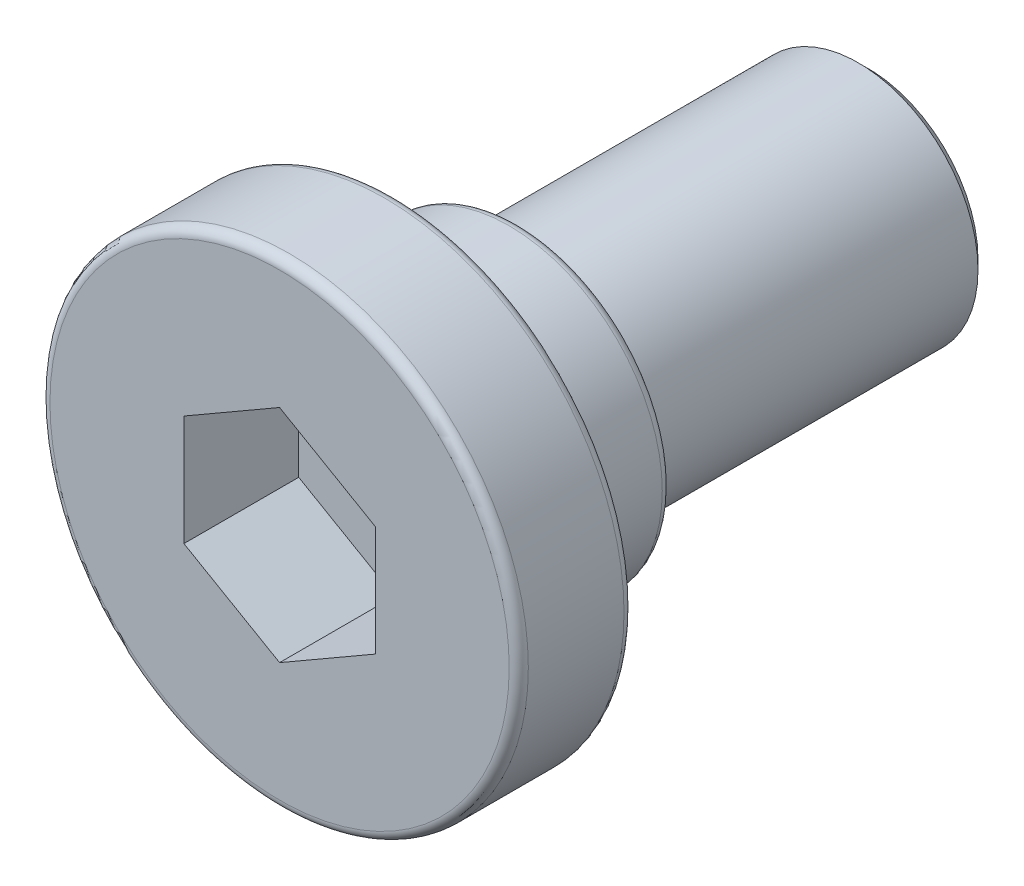
ISO-10303-21;
HEADER;
FILE_DESCRIPTION(('STEP AP214'),'2;1');
FILE_NAME('part.step','',(''),(''),'','','');
FILE_SCHEMA(('AUTOMOTIVE_DESIGN { 1 0 10303 214 1 1 1 1 }'));
ENDSEC;
DATA;
#1=APPLICATION_CONTEXT('core data for automotive mechanical design processes');
#2=APPLICATION_PROTOCOL_DEFINITION('international standard','automotive_design',2000,#1);
#3=PRODUCT_CONTEXT('',#1,'mechanical');
#4=PRODUCT('Part','Part','',(#3));
#5=PRODUCT_RELATED_PRODUCT_CATEGORY('part','',(#4));
#6=PRODUCT_DEFINITION_FORMATION('','',#4);
#7=PRODUCT_DEFINITION_CONTEXT('part definition',#1,'design');
#8=PRODUCT_DEFINITION('design','',#6,#7);
#9=PRODUCT_DEFINITION_SHAPE('','',#8);
#10=(LENGTH_UNIT() NAMED_UNIT(*) SI_UNIT(.MILLI.,.METRE.));
#11=(NAMED_UNIT(*) PLANE_ANGLE_UNIT() SI_UNIT($,.RADIAN.));
#12=(NAMED_UNIT(*) SI_UNIT($,.STERADIAN.) SOLID_ANGLE_UNIT());
#13=UNCERTAINTY_MEASURE_WITH_UNIT(LENGTH_MEASURE(1.E-05),#10,'distance_accuracy_value','');
#14=(GEOMETRIC_REPRESENTATION_CONTEXT(3) GLOBAL_UNCERTAINTY_ASSIGNED_CONTEXT((#13)) GLOBAL_UNIT_ASSIGNED_CONTEXT((#10,
#11,#12)) REPRESENTATION_CONTEXT('',''));
#15=CARTESIAN_POINT('',(0.,0.,0.));
#16=DIRECTION('',(0.,0.,1.));
#17=DIRECTION('',(1.,0.,0.));
#18=AXIS2_PLACEMENT_3D('',#15,#16,#17);
#19=CARTESIAN_POINT('',(0.,0.,0.));
#20=DIRECTION('',(0.,0.,1.));
#21=DIRECTION('',(1.,0.,0.));
#22=AXIS2_PLACEMENT_3D('',#19,#20,#21);
#23=PLANE('',#22);
#24=CARTESIAN_POINT('',(0.,0.,5.68434324133352E-11));
#25=DIRECTION('',(0.,0.,1.));
#26=DIRECTION('',(1.,0.,0.));
#27=AXIS2_PLACEMENT_3D('',#24,#25,#26);
#28=CIRCLE('',#27,1.15000000005239);
#29=CARTESIAN_POINT('',(1.15000000005239,0.,5.68434324133352E-11));
#30=VERTEX_POINT('',#29);
#31=EDGE_CURVE('E172',#30,#30,#28,.T.);
#32=ORIENTED_EDGE('',*,*,#31,.F.);
#33=EDGE_LOOP('',(#32));
#34=FACE_BOUND('',#33,.T.);
#35=ADVANCED_FACE('F16',(#34),#23,.F.);
#36=CARTESIAN_POINT('',(0.,0.,0.0999999998612111));
#37=DIRECTION('',(0.,0.,1.));
#38=DIRECTION('',(1.,0.,0.));
#39=AXIS2_PLACEMENT_3D('',#36,#37,#38);
#40=CONICAL_SURFACE('',#39,1.2499999999136,0.785398163681665);
#41=ORIENTED_EDGE('',*,*,#31,.T.);
#42=EDGE_LOOP('',(#41));
#43=FACE_BOUND('',#42,.T.);
#44=CARTESIAN_POINT('',(0.,0.,0.099999999999999));
#45=DIRECTION('',(0.,0.,-1.));
#46=DIRECTION('',(-1.,0.,0.));
#47=AXIS2_PLACEMENT_3D('',#44,#45,#46);
#48=CIRCLE('',#47,1.25);
#49=CARTESIAN_POINT('',(-1.25,0.,0.099999999999999));
#50=VERTEX_POINT('',#49);
#51=EDGE_CURVE('E131',#50,#50,#48,.F.);
#52=ORIENTED_EDGE('',*,*,#51,.F.);
#53=EDGE_LOOP('',(#52));
#54=FACE_BOUND('',#53,.T.);
#55=ADVANCED_FACE('F478',(#43,#54),#40,.T.);
#56=CARTESIAN_POINT('',(0.,0.,3.65));
#57=DIRECTION('',(0.,0.,-1.));
#58=DIRECTION('',(-1.,0.,0.));
#59=AXIS2_PLACEMENT_3D('',#56,#57,#58);
#60=CYLINDRICAL_SURFACE('',#59,1.25);
#61=CARTESIAN_POINT('',(0.,0.,3.65));
#62=DIRECTION('',(0.,0.,-1.));
#63=DIRECTION('',(-1.,0.,0.));
#64=AXIS2_PLACEMENT_3D('',#61,#62,#63);
#65=CIRCLE('',#64,1.25);
#66=CARTESIAN_POINT('',(-1.25,0.,3.65));
#67=VERTEX_POINT('',#66);
#68=EDGE_CURVE('E115',#67,#67,#65,.T.);
#69=ORIENTED_EDGE('',*,*,#68,.T.);
#70=EDGE_LOOP('',(#69));
#71=FACE_BOUND('',#70,.T.);
#72=ORIENTED_EDGE('',*,*,#51,.T.);
#73=EDGE_LOOP('',(#72));
#74=FACE_BOUND('',#73,.T.);
#75=ADVANCED_FACE('F470',(#71,#74),#60,.T.);
#76=CARTESIAN_POINT('',(0.,0.,3.65));
#77=DIRECTION('',(0.,0.,1.));
#78=DIRECTION('',(1.,0.,0.));
#79=AXIS2_PLACEMENT_3D('',#76,#77,#78);
#80=PLANE('',#79);
#81=ORIENTED_EDGE('',*,*,#68,.F.);
#82=EDGE_LOOP('',(#81));
#83=FACE_BOUND('',#82,.T.);
#84=CARTESIAN_POINT('',(0.,0.,3.65));
#85=DIRECTION('',(0.,0.,1.));
#86=DIRECTION('',(1.,0.,0.));
#87=AXIS2_PLACEMENT_3D('',#84,#85,#86);
#88=CIRCLE('',#87,1.5);
#89=CARTESIAN_POINT('',(1.5,0.,3.65));
#90=VERTEX_POINT('',#89);
#91=CARTESIAN_POINT('',(-1.5,0.,3.65));
#92=VERTEX_POINT('',#91);
#93=EDGE_CURVE('E106',#90,#92,#88,.T.);
#94=ORIENTED_EDGE('',*,*,#93,.F.);
#95=CARTESIAN_POINT('',(0.,0.,3.65));
#96=DIRECTION('',(0.,0.,1.));
#97=DIRECTION('',(-1.,0.,0.));
#98=AXIS2_PLACEMENT_3D('',#95,#96,#97);
#99=CIRCLE('',#98,1.5);
#100=EDGE_CURVE('E112',#92,#90,#99,.T.);
#101=ORIENTED_EDGE('',*,*,#100,.F.);
#102=EDGE_LOOP('',(#94,#101));
#103=FACE_BOUND('',#102,.T.);
#104=ADVANCED_FACE('F111',(#83,#103),#80,.F.);
#105=CARTESIAN_POINT('',(0.,0.,3.75));
#106=DIRECTION('',(0.,0.,1.));
#107=DIRECTION('',(1.,0.,0.));
#108=AXIS2_PLACEMENT_3D('',#105,#106,#107);
#109=TOROIDAL_SURFACE('',#108,1.5,0.1);
#110=ORIENTED_EDGE('',*,*,#93,.T.);
#111=ORIENTED_EDGE('',*,*,#100,.T.);
#112=EDGE_LOOP('',(#110,#111));
#113=FACE_BOUND('',#112,.T.);
#114=CARTESIAN_POINT('',(0.,0.,3.75));
#115=DIRECTION('',(0.,0.,-1.));
#116=DIRECTION('',(-1.,0.,0.));
#117=AXIS2_PLACEMENT_3D('',#114,#115,#116);
#118=CIRCLE('',#117,1.6);
#119=CARTESIAN_POINT('',(-1.6,0.,3.75));
#120=VERTEX_POINT('',#119);
#121=EDGE_CURVE('E122',#120,#120,#118,.F.);
#122=ORIENTED_EDGE('',*,*,#121,.F.);
#123=EDGE_LOOP('',(#122));
#124=FACE_BOUND('',#123,.T.);
#125=ADVANCED_FACE('F119',(#113,#124),#109,.T.);
#126=CARTESIAN_POINT('',(0.,0.,4.95));
#127=DIRECTION('',(0.,0.,-1.));
#128=DIRECTION('',(-1.,0.,0.));
#129=AXIS2_PLACEMENT_3D('',#126,#127,#128);
#130=CYLINDRICAL_SURFACE('',#129,1.6);
#131=CARTESIAN_POINT('',(0.,0.,4.95));
#132=DIRECTION('',(0.,0.,-1.));
#133=DIRECTION('',(-1.,0.,0.));
#134=AXIS2_PLACEMENT_3D('',#131,#132,#133);
#135=CIRCLE('',#134,1.6);
#136=CARTESIAN_POINT('',(-1.6,0.,4.95));
#137=VERTEX_POINT('',#136);
#138=EDGE_CURVE('E155',#137,#137,#135,.T.);
#139=ORIENTED_EDGE('',*,*,#138,.T.);
#140=EDGE_LOOP('',(#139));
#141=FACE_BOUND('',#140,.T.);
#142=ORIENTED_EDGE('',*,*,#121,.T.);
#143=EDGE_LOOP('',(#142));
#144=FACE_BOUND('',#143,.T.);
#145=ADVANCED_FACE('F142',(#141,#144),#130,.T.);
#146=CARTESIAN_POINT('',(0.,0.,4.95));
#147=DIRECTION('',(0.,0.,1.));
#148=DIRECTION('',(1.,0.,0.));
#149=AXIS2_PLACEMENT_3D('',#146,#147,#148);
#150=PLANE('',#149);
#151=ORIENTED_EDGE('',*,*,#138,.F.);
#152=EDGE_LOOP('',(#151));
#153=FACE_BOUND('',#152,.T.);
#154=CARTESIAN_POINT('',(0.,0.,4.95));
#155=DIRECTION('',(0.,0.,1.));
#156=DIRECTION('',(1.,0.,0.));
#157=AXIS2_PLACEMENT_3D('',#154,#155,#156);
#158=CIRCLE('',#157,2.4);
#159=CARTESIAN_POINT('',(2.4,0.,4.95));
#160=VERTEX_POINT('',#159);
#161=CARTESIAN_POINT('',(-2.4,0.,4.95));
#162=VERTEX_POINT('',#161);
#163=EDGE_CURVE('E162',#160,#162,#158,.T.);
#164=ORIENTED_EDGE('',*,*,#163,.F.);
#165=CARTESIAN_POINT('',(0.,0.,4.95));
#166=DIRECTION('',(0.,0.,1.));
#167=DIRECTION('',(-1.,0.,0.));
#168=AXIS2_PLACEMENT_3D('',#165,#166,#167);
#169=CIRCLE('',#168,2.4);
#170=EDGE_CURVE('E168',#162,#160,#169,.T.);
#171=ORIENTED_EDGE('',*,*,#170,.F.);
#172=EDGE_LOOP('',(#164,#171));
#173=FACE_BOUND('',#172,.T.);
#174=ADVANCED_FACE('F230',(#153,#173),#150,.F.);
#175=CARTESIAN_POINT('',(0.,0.,5.05));
#176=DIRECTION('',(0.,0.,1.));
#177=DIRECTION('',(1.,0.,0.));
#178=AXIS2_PLACEMENT_3D('',#175,#176,#177);
#179=TOROIDAL_SURFACE('',#178,2.4,0.1);
#180=ORIENTED_EDGE('',*,*,#163,.T.);
#181=ORIENTED_EDGE('',*,*,#170,.T.);
#182=EDGE_LOOP('',(#180,#181));
#183=FACE_BOUND('',#182,.T.);
#184=CARTESIAN_POINT('',(0.,0.,5.05));
#185=DIRECTION('',(0.,0.,-1.));
#186=DIRECTION('',(-1.,0.,0.));
#187=AXIS2_PLACEMENT_3D('',#184,#185,#186);
#188=CIRCLE('',#187,2.5);
#189=CARTESIAN_POINT('',(-2.5,0.,5.05));
#190=VERTEX_POINT('',#189);
#191=EDGE_CURVE('E222',#190,#190,#188,.F.);
#192=ORIENTED_EDGE('',*,*,#191,.F.);
#193=EDGE_LOOP('',(#192));
#194=FACE_BOUND('',#193,.T.);
#195=ADVANCED_FACE('F226',(#183,#194),#179,.T.);
#196=CARTESIAN_POINT('',(0.,0.,6.15));
#197=DIRECTION('',(0.,0.,-1.));
#198=DIRECTION('',(-1.,0.,0.));
#199=AXIS2_PLACEMENT_3D('',#196,#197,#198);
#200=CYLINDRICAL_SURFACE('',#199,2.5);
#201=CARTESIAN_POINT('',(0.,0.,6.05));
#202=DIRECTION('',(0.,0.,1.));
#203=DIRECTION('',(1.,0.,0.));
#204=AXIS2_PLACEMENT_3D('',#201,#202,#203);
#205=CIRCLE('',#204,2.5);
#206=CARTESIAN_POINT('',(2.5,0.,6.05));
#207=VERTEX_POINT('',#206);
#208=EDGE_CURVE('E213',#207,#207,#205,.T.);
#209=ORIENTED_EDGE('',*,*,#208,.F.);
#210=EDGE_LOOP('',(#209));
#211=FACE_BOUND('',#210,.T.);
#212=ORIENTED_EDGE('',*,*,#191,.T.);
#213=EDGE_LOOP('',(#212));
#214=FACE_BOUND('',#213,.T.);
#215=ADVANCED_FACE('F229',(#211,#214),#200,.T.);
#216=CARTESIAN_POINT('',(0.,0.,4.95));
#217=DIRECTION('',(0.,0.,1.));
#218=DIRECTION('',(1.,0.,0.));
#219=AXIS2_PLACEMENT_3D('',#216,#217,#218);
#220=PLANE('',#219);
#221=DIRECTION('',(0.866025403784439,0.5,0.));
#222=VECTOR('',#221,1.);
#223=CARTESIAN_POINT('',(0.,-1.15470053837925,4.95));
#224=LINE('',#223,#222);
#225=CARTESIAN_POINT('',(0.,-1.15470053837925,4.95));
#226=VERTEX_POINT('',#225);
#227=CARTESIAN_POINT('',(1.,-0.577350269189626,4.95));
#228=VERTEX_POINT('',#227);
#229=EDGE_CURVE('E345',#226,#228,#224,.T.);
#230=ORIENTED_EDGE('',*,*,#229,.T.);
#231=DIRECTION('',(0.,1.,0.));
#232=VECTOR('',#231,1.);
#233=CARTESIAN_POINT('',(1.,-0.577350269189626,4.95));
#234=LINE('',#233,#232);
#235=CARTESIAN_POINT('',(1.,0.577350269189626,4.95));
#236=VERTEX_POINT('',#235);
#237=EDGE_CURVE('E350',#228,#236,#234,.T.);
#238=ORIENTED_EDGE('',*,*,#237,.T.);
#239=DIRECTION('',(-0.866025403784439,0.5,0.));
#240=VECTOR('',#239,1.);
#241=CARTESIAN_POINT('',(1.,0.577350269189626,4.95));
#242=LINE('',#241,#240);
#243=CARTESIAN_POINT('',(0.,1.15470053837925,4.95));
#244=VERTEX_POINT('',#243);
#245=EDGE_CURVE('E207',#236,#244,#242,.T.);
#246=ORIENTED_EDGE('',*,*,#245,.T.);
#247=DIRECTION('',(-0.866025403784439,-0.5,0.));
#248=VECTOR('',#247,1.);
#249=CARTESIAN_POINT('',(0.,1.15470053837925,4.95));
#250=LINE('',#249,#248);
#251=CARTESIAN_POINT('',(-1.,0.577350269189626,4.95));
#252=VERTEX_POINT('',#251);
#253=EDGE_CURVE('E323',#244,#252,#250,.T.);
#254=ORIENTED_EDGE('',*,*,#253,.T.);
#255=DIRECTION('',(0.,-1.,0.));
#256=VECTOR('',#255,1.);
#257=CARTESIAN_POINT('',(-1.,0.577350269189626,4.95));
#258=LINE('',#257,#256);
#259=CARTESIAN_POINT('',(-1.,-0.577350269189626,4.95));
#260=VERTEX_POINT('',#259);
#261=EDGE_CURVE('E333',#252,#260,#258,.T.);
#262=ORIENTED_EDGE('',*,*,#261,.T.);
#263=DIRECTION('',(0.866025403784439,-0.5,0.));
#264=VECTOR('',#263,1.);
#265=CARTESIAN_POINT('',(-1.,-0.577350269189626,4.95));
#266=LINE('',#265,#264);
#267=EDGE_CURVE('E339',#260,#226,#266,.T.);
#268=ORIENTED_EDGE('',*,*,#267,.T.);
#269=EDGE_LOOP('',(#230,#238,#246,#254,#262,#268));
#270=FACE_BOUND('',#269,.T.);
#271=ADVANCED_FACE('F198',(#270),#220,.T.);
#272=CARTESIAN_POINT('',(0.,0.,6.05));
#273=DIRECTION('',(0.,0.,1.));
#274=DIRECTION('',(1.,0.,0.));
#275=AXIS2_PLACEMENT_3D('',#272,#273,#274);
#276=TOROIDAL_SURFACE('',#275,2.4,0.1);
#277=ORIENTED_EDGE('',*,*,#208,.T.);
#278=EDGE_LOOP('',(#277));
#279=FACE_BOUND('',#278,.T.);
#280=CARTESIAN_POINT('',(0.,0.,6.15));
#281=DIRECTION('',(0.,0.,-1.));
#282=DIRECTION('',(1.,0.,0.));
#283=AXIS2_PLACEMENT_3D('',#280,#281,#282);
#284=CIRCLE('',#283,2.4);
#285=CARTESIAN_POINT('',(-2.4,0.,6.15));
#286=VERTEX_POINT('',#285);
#287=CARTESIAN_POINT('',(2.4,0.,6.15));
#288=VERTEX_POINT('',#287);
#289=EDGE_CURVE('E209',#286,#288,#284,.F.);
#290=ORIENTED_EDGE('',*,*,#289,.F.);
#291=CARTESIAN_POINT('',(0.,0.,6.15));
#292=DIRECTION('',(0.,0.,-1.));
#293=DIRECTION('',(-1.,0.,0.));
#294=AXIS2_PLACEMENT_3D('',#291,#292,#293);
#295=CIRCLE('',#294,2.4);
#296=EDGE_CURVE('E179',#288,#286,#295,.F.);
#297=ORIENTED_EDGE('',*,*,#296,.F.);
#298=EDGE_LOOP('',(#290,#297));
#299=FACE_BOUND('',#298,.T.);
#300=ADVANCED_FACE('F186',(#279,#299),#276,.T.);
#301=CARTESIAN_POINT('',(1.,0.577350269189626,4.95));
#302=DIRECTION('',(0.5,0.866025403784439,0.));
#303=DIRECTION('',(-0.866025403784439,0.5,0.));
#304=AXIS2_PLACEMENT_3D('',#301,#302,#303);
#305=PLANE('',#304);
#306=DIRECTION('',(0.,0.,1.));
#307=VECTOR('',#306,1.);
#308=CARTESIAN_POINT('',(0.,1.15470053837925,4.95));
#309=LINE('',#308,#307);
#310=CARTESIAN_POINT('',(0.,1.15470053837925,6.15));
#311=VERTEX_POINT('',#310);
#312=EDGE_CURVE('E326',#311,#244,#309,.F.);
#313=ORIENTED_EDGE('',*,*,#312,.T.);
#314=ORIENTED_EDGE('',*,*,#245,.F.);
#315=DIRECTION('',(0.,0.,1.));
#316=VECTOR('',#315,1.);
#317=CARTESIAN_POINT('',(1.,0.577350269189626,4.95));
#318=LINE('',#317,#316);
#319=CARTESIAN_POINT('',(1.,0.577350269189626,6.15));
#320=VERTEX_POINT('',#319);
#321=EDGE_CURVE('E348',#236,#320,#318,.T.);
#322=ORIENTED_EDGE('',*,*,#321,.T.);
#323=DIRECTION('',(0.866025403784438,-0.5,0.));
#324=VECTOR('',#323,1.);
#325=CARTESIAN_POINT('',(0.,1.15470053837925,6.15));
#326=LINE('',#325,#324);
#327=EDGE_CURVE('E318',#311,#320,#326,.T.);
#328=ORIENTED_EDGE('',*,*,#327,.F.);
#329=EDGE_LOOP('',(#313,#314,#322,#328));
#330=FACE_BOUND('',#329,.T.);
#331=ADVANCED_FACE('F197',(#330),#305,.F.);
#332=CARTESIAN_POINT('',(1.,-0.577350269189626,4.95));
#333=DIRECTION('',(1.,0.,0.));
#334=DIRECTION('',(0.,1.,0.));
#335=AXIS2_PLACEMENT_3D('',#332,#333,#334);
#336=PLANE('',#335);
#337=ORIENTED_EDGE('',*,*,#321,.F.);
#338=ORIENTED_EDGE('',*,*,#237,.F.);
#339=DIRECTION('',(0.,0.,1.));
#340=VECTOR('',#339,1.);
#341=CARTESIAN_POINT('',(1.,-0.577350269189626,4.95));
#342=LINE('',#341,#340);
#343=CARTESIAN_POINT('',(1.,-0.577350269189626,6.15));
#344=VERTEX_POINT('',#343);
#345=EDGE_CURVE('E342',#228,#344,#342,.T.);
#346=ORIENTED_EDGE('',*,*,#345,.T.);
#347=DIRECTION('',(0.,1.,0.));
#348=VECTOR('',#347,1.);
#349=CARTESIAN_POINT('',(1.,0.,6.15));
#350=LINE('',#349,#348);
#351=EDGE_CURVE('E314',#320,#344,#350,.F.);
#352=ORIENTED_EDGE('',*,*,#351,.F.);
#353=EDGE_LOOP('',(#337,#338,#346,#352));
#354=FACE_BOUND('',#353,.T.);
#355=ADVANCED_FACE('F371',(#354),#336,.F.);
#356=CARTESIAN_POINT('',(0.,-1.15470053837925,4.95));
#357=DIRECTION('',(0.5,-0.866025403784439,0.));
#358=DIRECTION('',(0.866025403784439,0.5,0.));
#359=AXIS2_PLACEMENT_3D('',#356,#357,#358);
#360=PLANE('',#359);
#361=ORIENTED_EDGE('',*,*,#345,.F.);
#362=ORIENTED_EDGE('',*,*,#229,.F.);
#363=DIRECTION('',(0.,0.,1.));
#364=VECTOR('',#363,1.);
#365=CARTESIAN_POINT('',(0.,-1.15470053837925,4.95));
#366=LINE('',#365,#364);
#367=CARTESIAN_POINT('',(0.,-1.15470053837925,6.15));
#368=VERTEX_POINT('',#367);
#369=EDGE_CURVE('E336',#226,#368,#366,.T.);
#370=ORIENTED_EDGE('',*,*,#369,.T.);
#371=DIRECTION('',(-0.866025403784439,-0.5,0.));
#372=VECTOR('',#371,1.);
#373=CARTESIAN_POINT('',(1.,-0.577350269189626,6.15));
#374=LINE('',#373,#372);
#375=EDGE_CURVE('E310',#344,#368,#374,.T.);
#376=ORIENTED_EDGE('',*,*,#375,.F.);
#377=EDGE_LOOP('',(#361,#362,#370,#376));
#378=FACE_BOUND('',#377,.T.);
#379=ADVANCED_FACE('F367',(#378),#360,.F.);
#380=CARTESIAN_POINT('',(-1.,-0.577350269189626,4.95));
#381=DIRECTION('',(-0.5,-0.866025403784439,0.));
#382=DIRECTION('',(0.866025403784439,-0.5,0.));
#383=AXIS2_PLACEMENT_3D('',#380,#381,#382);
#384=PLANE('',#383);
#385=ORIENTED_EDGE('',*,*,#369,.F.);
#386=ORIENTED_EDGE('',*,*,#267,.F.);
#387=DIRECTION('',(0.,0.,1.));
#388=VECTOR('',#387,1.);
#389=CARTESIAN_POINT('',(-1.,-0.577350269189626,4.95));
#390=LINE('',#389,#388);
#391=CARTESIAN_POINT('',(-1.,-0.577350269189626,6.15));
#392=VERTEX_POINT('',#391);
#393=EDGE_CURVE('E330',#260,#392,#390,.T.);
#394=ORIENTED_EDGE('',*,*,#393,.T.);
#395=DIRECTION('',(-0.866025403784439,0.5,0.));
#396=VECTOR('',#395,1.);
#397=CARTESIAN_POINT('',(0.,-1.15470053837925,6.15));
#398=LINE('',#397,#396);
#399=EDGE_CURVE('E306',#368,#392,#398,.T.);
#400=ORIENTED_EDGE('',*,*,#399,.F.);
#401=EDGE_LOOP('',(#385,#386,#394,#400));
#402=FACE_BOUND('',#401,.T.);
#403=ADVANCED_FACE('F363',(#402),#384,.F.);
#404=CARTESIAN_POINT('',(-1.,0.577350269189626,4.95));
#405=DIRECTION('',(-1.,0.,0.));
#406=DIRECTION('',(0.,-1.,0.));
#407=AXIS2_PLACEMENT_3D('',#404,#405,#406);
#408=PLANE('',#407);
#409=ORIENTED_EDGE('',*,*,#393,.F.);
#410=ORIENTED_EDGE('',*,*,#261,.F.);
#411=DIRECTION('',(0.,0.,1.));
#412=VECTOR('',#411,1.);
#413=CARTESIAN_POINT('',(-1.,0.577350269189626,4.95));
#414=LINE('',#413,#412);
#415=CARTESIAN_POINT('',(-1.,0.577350269189626,6.15));
#416=VERTEX_POINT('',#415);
#417=EDGE_CURVE('E41',#252,#416,#414,.T.);
#418=ORIENTED_EDGE('',*,*,#417,.T.);
#419=DIRECTION('',(0.,1.,0.));
#420=VECTOR('',#419,1.);
#421=CARTESIAN_POINT('',(-1.,0.,6.15));
#422=LINE('',#421,#420);
#423=EDGE_CURVE('E28',#392,#416,#422,.T.);
#424=ORIENTED_EDGE('',*,*,#423,.F.);
#425=EDGE_LOOP('',(#409,#410,#418,#424));
#426=FACE_BOUND('',#425,.T.);
#427=ADVANCED_FACE('F282',(#426),#408,.F.);
#428=CARTESIAN_POINT('',(0.,1.15470053837925,4.95));
#429=DIRECTION('',(-0.5,0.866025403784439,0.));
#430=DIRECTION('',(-0.866025403784439,-0.5,0.));
#431=AXIS2_PLACEMENT_3D('',#428,#429,#430);
#432=PLANE('',#431);
#433=ORIENTED_EDGE('',*,*,#417,.F.);
#434=ORIENTED_EDGE('',*,*,#253,.F.);
#435=ORIENTED_EDGE('',*,*,#312,.F.);
#436=DIRECTION('',(0.866025403784438,0.5,0.));
#437=VECTOR('',#436,1.);
#438=CARTESIAN_POINT('',(-1.,0.577350269189626,6.15));
#439=LINE('',#438,#437);
#440=EDGE_CURVE('E11',#416,#311,#439,.T.);
#441=ORIENTED_EDGE('',*,*,#440,.F.);
#442=EDGE_LOOP('',(#433,#434,#435,#441));
#443=FACE_BOUND('',#442,.T.);
#444=ADVANCED_FACE('F275',(#443),#432,.F.);
#445=CARTESIAN_POINT('',(0.,0.,6.15));
#446=DIRECTION('',(0.,0.,1.));
#447=DIRECTION('',(1.,0.,0.));
#448=AXIS2_PLACEMENT_3D('',#445,#446,#447);
#449=PLANE('',#448);
#450=ORIENTED_EDGE('',*,*,#423,.T.);
#451=ORIENTED_EDGE('',*,*,#440,.T.);
#452=ORIENTED_EDGE('',*,*,#327,.T.);
#453=ORIENTED_EDGE('',*,*,#351,.T.);
#454=ORIENTED_EDGE('',*,*,#375,.T.);
#455=ORIENTED_EDGE('',*,*,#399,.T.);
#456=EDGE_LOOP('',(#450,#451,#452,#453,#454,#455));
#457=FACE_BOUND('',#456,.T.);
#458=ORIENTED_EDGE('',*,*,#296,.T.);
#459=ORIENTED_EDGE('',*,*,#289,.T.);
#460=EDGE_LOOP('',(#458,#459));
#461=FACE_BOUND('',#460,.T.);
#462=ADVANCED_FACE('F273',(#457,#461),#449,.T.);
#463=CLOSED_SHELL('',(#35,#55,#75,#104,#125,#145,#174,#195,#215,#271,#300,#331,#355,#379,#403,
#427,#444,#462));
#464=MANIFOLD_SOLID_BREP('B1',#463);
#465=ADVANCED_BREP_SHAPE_REPRESENTATION('',(#18,#464),#14);
#466=SHAPE_DEFINITION_REPRESENTATION(#9,#465);
ENDSEC;
END-ISO-10303-21;
